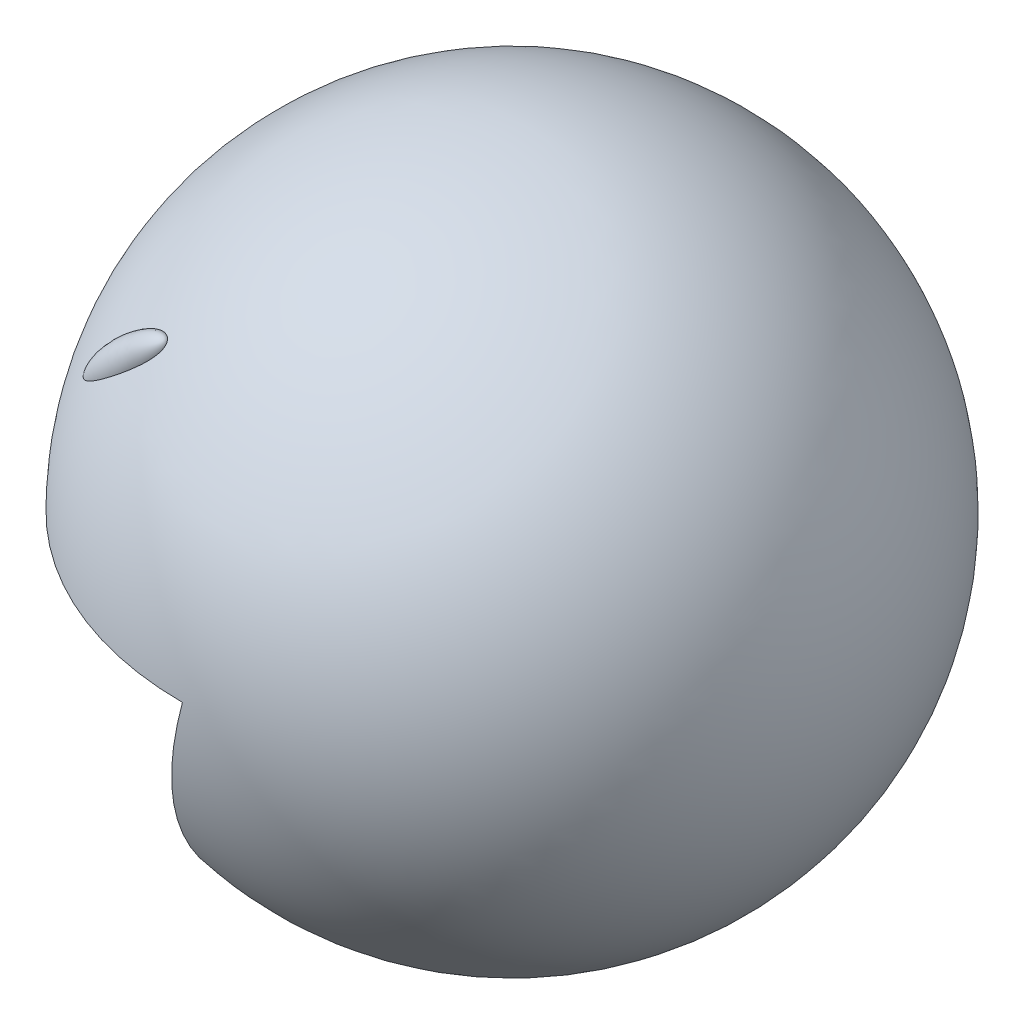
ISO-10303-21;
HEADER;
FILE_DESCRIPTION(('STEP AP214'),'2;1');
FILE_NAME('part.step','',(''),(''),'','','');
FILE_SCHEMA(('AUTOMOTIVE_DESIGN { 1 0 10303 214 1 1 1 1 }'));
ENDSEC;
DATA;
#1=APPLICATION_CONTEXT('core data for automotive mechanical design processes');
#2=APPLICATION_PROTOCOL_DEFINITION('international standard','automotive_design',2000,#1);
#3=PRODUCT_CONTEXT('',#1,'mechanical');
#4=PRODUCT('Part','Part','',(#3));
#5=PRODUCT_RELATED_PRODUCT_CATEGORY('part','',(#4));
#6=PRODUCT_DEFINITION_FORMATION('','',#4);
#7=PRODUCT_DEFINITION_CONTEXT('part definition',#1,'design');
#8=PRODUCT_DEFINITION('design','',#6,#7);
#9=PRODUCT_DEFINITION_SHAPE('','',#8);
#10=(LENGTH_UNIT() NAMED_UNIT(*) SI_UNIT(.MILLI.,.METRE.));
#11=(NAMED_UNIT(*) PLANE_ANGLE_UNIT() SI_UNIT($,.RADIAN.));
#12=(NAMED_UNIT(*) SI_UNIT($,.STERADIAN.) SOLID_ANGLE_UNIT());
#13=UNCERTAINTY_MEASURE_WITH_UNIT(LENGTH_MEASURE(1.E-05),#10,'distance_accuracy_value','');
#14=(GEOMETRIC_REPRESENTATION_CONTEXT(3) GLOBAL_UNCERTAINTY_ASSIGNED_CONTEXT((#13)) GLOBAL_UNIT_ASSIGNED_CONTEXT((#10,
#11,#12)) REPRESENTATION_CONTEXT('',''));
#15=CARTESIAN_POINT('',(0.,0.,0.));
#16=DIRECTION('',(0.,0.,1.));
#17=DIRECTION('',(1.,0.,0.));
#18=AXIS2_PLACEMENT_3D('',#15,#16,#17);
#19=CARTESIAN_POINT('',(0.,0.,0.));
#20=DIRECTION('',(0.,0.,1.));
#21=DIRECTION('',(-0.258819045102531,-0.965925826289065,0.));
#22=AXIS2_PLACEMENT_3D('',#19,#20,#21);
#23=SPHERICAL_SURFACE('',#22,25.4);
#24=CARTESIAN_POINT('',(0.,0.,0.));
#25=DIRECTION('',(0.,1.,0.));
#26=DIRECTION('',(0.,0.,1.));
#27=AXIS2_PLACEMENT_3D('',#24,#25,#26);
#28=CIRCLE('',#27,25.4);
#29=CARTESIAN_POINT('',(0.,0.,-25.4));
#30=VERTEX_POINT('',#29);
#31=CARTESIAN_POINT('',(0.,0.,25.4));
#32=VERTEX_POINT('',#31);
#33=EDGE_CURVE('E58',#30,#32,#28,.T.);
#34=ORIENTED_EDGE('',*,*,#33,.T.);
#35=CARTESIAN_POINT('',(0.,0.,0.));
#36=DIRECTION('',(-0.965925826289065,0.258819045102531,0.));
#37=DIRECTION('',(0.,0.,1.));
#38=AXIS2_PLACEMENT_3D('',#35,#36,#37);
#39=CIRCLE('',#38,25.4);
#40=EDGE_CURVE('E90',#30,#32,#39,.T.);
#41=ORIENTED_EDGE('',*,*,#40,.F.);
#42=EDGE_LOOP('',(#34,#41));
#43=FACE_BOUND('',#42,.T.);
#44=CARTESIAN_POINT('',(-8.89116224380287,15.9455624798362,17.6591696055057));
#45=CARTESIAN_POINT('',(-8.91353390940422,15.9576761112741,17.6369675436586));
#46=CARTESIAN_POINT('',(-8.93827595442611,15.9672566944102,17.6157620967731));
#47=CARTESIAN_POINT('',(-8.99077694117802,15.9819909203043,17.5756379771903));
#48=CARTESIAN_POINT('',(-9.01854682327902,15.9871278671183,17.5567281564562));
#49=CARTESIAN_POINT('',(-9.06952724001722,15.9930757581065,17.5250079443751));
#50=CARTESIAN_POINT('',(-9.09240230293788,15.994588295449,17.5117693149271));
#51=CARTESIAN_POINT('',(-9.13885310717414,15.9957833985665,17.4864798562906));
#52=CARTESIAN_POINT('',(-9.16242926506568,15.9954648538287,17.4744297524243));
#53=CARTESIAN_POINT('',(-9.2338471449283,15.9922229757068,17.4398301149314));
#54=CARTESIAN_POINT('',(-9.28234139969502,15.9870102342752,17.4188531628773));
#55=CARTESIAN_POINT('',(-9.39523485206869,15.9699139555825,17.3740113783389));
#56=CARTESIAN_POINT('',(-9.45983065311779,15.9564459795542,17.3513194374734));
#57=CARTESIAN_POINT('',(-9.58905032846447,15.9242799471311,17.3098901167807));
#58=CARTESIAN_POINT('',(-9.6536740248086,15.9055720475432,17.2911602971638));
#59=CARTESIAN_POINT('',(-9.78276573580876,15.8641583823474,17.2566187626621));
#60=CARTESIAN_POINT('',(-9.84723138560478,15.8414332340195,17.240821993392));
#61=CARTESIAN_POINT('',(-9.97545919052756,15.7929219174829,17.2115873922165));
#62=CARTESIAN_POINT('',(-10.0392218932266,15.7671383476288,17.1981475816246));
#63=CARTESIAN_POINT('',(-10.1674074172732,15.7124745303344,17.1728592010475));
#64=CARTESIAN_POINT('',(-10.2318146499432,15.6835393315435,17.1610513739623));
#65=CARTESIAN_POINT('',(-10.3598699088877,15.6234634510338,17.1390084482133));
#66=CARTESIAN_POINT('',(-10.4235178050829,15.5923223976007,17.1287736155443));
#67=CARTESIAN_POINT('',(-10.613519802455,15.495965443862,17.0999651781532));
#68=CARTESIAN_POINT('',(-10.7387280707426,15.4279049351151,17.083325957848));
#69=CARTESIAN_POINT('',(-10.986241795471,15.2858257941988,17.0536397688818));
#70=CARTESIAN_POINT('',(-11.1085447180255,15.2118021917579,17.0405958377984));
#71=CARTESIAN_POINT('',(-11.3504155219181,15.0587591338079,17.017123140372));
#72=CARTESIAN_POINT('',(-11.4699803011207,14.9797343600308,17.006697218589));
#73=CARTESIAN_POINT('',(-11.7062214529606,14.8175410411014,16.9878030858072));
#74=CARTESIAN_POINT('',(-11.8229008074868,14.7343770664648,16.9793327712655));
#75=CARTESIAN_POINT('',(-12.053558987595,14.564333053911,16.9638587836859));
#76=CARTESIAN_POINT('',(-12.1675385450574,14.4774540414306,16.9568547090387));
#77=CARTESIAN_POINT('',(-12.4986406719455,14.2172137937197,16.9378904412004));
#78=CARTESIAN_POINT('',(-12.7122007795079,14.0391904436293,16.9274458520451));
#79=CARTESIAN_POINT('',(-13.1298655187225,13.6720444690644,16.9091477869116));
#80=CARTESIAN_POINT('',(-13.3339644182545,13.4829152693435,16.901295864523));
#81=CARTESIAN_POINT('',(-13.6326702576118,13.1915638642341,16.8911902736518));
#82=CARTESIAN_POINT('',(-13.7310031422449,13.0931653941925,16.8881003471023));
#83=CARTESIAN_POINT('',(-13.9250850004742,12.8938376233244,16.8825446395112));
#84=CARTESIAN_POINT('',(-14.0208340862428,12.7929084327341,16.8800788313352));
#85=CARTESIAN_POINT('',(-14.2095347830379,12.5885684845242,16.8759117926886));
#86=CARTESIAN_POINT('',(-14.3024880969153,12.4851593093563,16.8742100876428));
#87=CARTESIAN_POINT('',(-14.4854119049357,12.2757332843934,16.8718268863886));
#88=CARTESIAN_POINT('',(-14.5753826842047,12.1697166855621,16.8711452923824));
#89=CARTESIAN_POINT('',(-14.7225145765493,11.9907433194322,16.8712247781343));
#90=CARTESIAN_POINT('',(-14.7806100898902,11.918553708524,16.8715805029799));
#91=CARTESIAN_POINT('',(-14.8951537392473,11.772858196197,16.8731382411201));
#92=CARTESIAN_POINT('',(-14.951601498529,11.6993519998642,16.8743404463956));
#93=CARTESIAN_POINT('',(-15.0626509544263,11.5508763205319,16.8778673739212));
#94=CARTESIAN_POINT('',(-15.1172509506382,11.4759055847459,16.880193101565));
#95=CARTESIAN_POINT('',(-15.2240668714516,11.3246182983741,16.8863664436986));
#96=CARTESIAN_POINT('',(-15.2762883521454,11.248305529782,16.8902102845439));
#97=CARTESIAN_POINT('',(-15.3779256807297,11.0940142631403,16.9000236345202));
#98=CARTESIAN_POINT('',(-15.4273434073731,11.016036929884,16.905991700261));
#99=CARTESIAN_POINT('',(-15.4986394916655,10.8976590163389,16.9173087470176));
#100=CARTESIAN_POINT('',(-15.5219198045683,10.857988943308,16.9214720051228));
#101=CARTESIAN_POINT('',(-15.5673527638898,10.7781257502726,16.9307904323057));
#102=CARTESIAN_POINT('',(-15.5895056009536,10.737932720148,16.9359454329802));
#103=CARTESIAN_POINT('',(-15.6270999202714,10.6670048355815,16.946089903503));
#104=CARTESIAN_POINT('',(-15.6428451067656,10.6363920311191,16.9508043663986));
#105=CARTESIAN_POINT('',(-15.6733782031849,10.5748233900709,16.9611182856303));
#106=CARTESIAN_POINT('',(-15.6881658183702,10.5438674512699,16.9667180126424));
#107=CARTESIAN_POINT('',(-15.7164884157548,10.4817268209021,16.9790045153972));
#108=CARTESIAN_POINT('',(-15.7300275142024,10.4505432757347,16.9856875028492));
#109=CARTESIAN_POINT('',(-15.7555480109054,10.3878827438272,17.0004646018117));
#110=CARTESIAN_POINT('',(-15.7675303960585,10.3564059566923,17.0085578115988));
#111=CARTESIAN_POINT('',(-15.7873399774986,10.2991373317171,17.0249364077842));
#112=CARTESIAN_POINT('',(-15.7955253057462,10.2733807840392,17.0329040823055));
#113=CARTESIAN_POINT('',(-15.8100323632966,10.2217886564012,17.0504753575002));
#114=CARTESIAN_POINT('',(-15.8163488402541,10.1959530560672,17.0600834513743));
#115=CARTESIAN_POINT('',(-15.826402425137,10.1442510735021,17.0815683614553));
#116=CARTESIAN_POINT('',(-15.8301023942054,10.1183892713872,17.093474903901));
#117=CARTESIAN_POINT('',(-15.8334918202353,10.0678972428921,17.1201282134172));
#118=CARTESIAN_POINT('',(-15.8332034685529,10.0432609666991,17.1348588153066));
#119=CARTESIAN_POINT('',(-15.8283882771245,10.0075094798523,17.1601900563493));
#120=CARTESIAN_POINT('',(-15.8258400085053,9.99532356823159,17.1696400195243));
#121=CARTESIAN_POINT('',(-15.8188220456493,9.97233295246547,17.1894644005809));
#122=CARTESIAN_POINT('',(-15.8143547699538,9.96152653189897,17.1998376418443));
#123=CARTESIAN_POINT('',(-15.8034089950129,9.94170786190058,17.2213516922765));
#124=CARTESIAN_POINT('',(-15.7969195823141,9.93270579449217,17.2324964049013));
#125=CARTESIAN_POINT('',(-15.7821365146749,9.91688658738505,17.2551375860941));
#126=CARTESIAN_POINT('',(-15.7738416426139,9.91007092932306,17.2666342874347));
#127=CARTESIAN_POINT('',(-15.7543523256961,9.89771351621112,17.2915003137772));
#128=CARTESIAN_POINT('',(-15.7429052643731,9.89256783538032,17.3048654472691));
#129=CARTESIAN_POINT('',(-15.7187174836094,9.88491885077951,17.3312041110604));
#130=CARTESIAN_POINT('',(-15.7059727253118,9.88242409119676,17.3441762449677));
#131=CARTESIAN_POINT('',(-15.682117164266,9.87985365081647,17.3672080929469));
#132=CARTESIAN_POINT('',(-15.6711338732527,9.8794189666155,17.3773665277677));
#133=CARTESIAN_POINT('',(-15.6488429079147,9.87973964179132,17.3972607961187));
#134=CARTESIAN_POINT('',(-15.6375357023214,9.88049335917986,17.4069971936774));
#135=CARTESIAN_POINT('',(-15.6032220719813,9.88421789652827,17.4356701480589));
#136=CARTESIAN_POINT('',(-15.5798840772967,9.88865598636552,17.4540136086065));
#137=CARTESIAN_POINT('',(-15.523016111191,9.90260847345572,17.4967461853263));
#138=CARTESIAN_POINT('',(-15.4893217044559,9.91347195087049,17.5204393145168));
#139=CARTESIAN_POINT('',(-15.4217630590703,9.93858890058851,17.5657476927051));
#140=CARTESIAN_POINT('',(-15.3878986147256,9.95284918834189,17.5873586399198));
#141=CARTESIAN_POINT('',(-15.3200437282937,9.98377423967947,17.6290199841762));
#142=CARTESIAN_POINT('',(-15.2860535663526,10.0004513142498,17.6490615287892));
#143=CARTESIAN_POINT('',(-15.2182180273397,10.0354856802273,17.6877555787621));
#144=CARTESIAN_POINT('',(-15.1843725372646,10.0538412248051,17.7064094924018));
#145=CARTESIAN_POINT('',(-15.1075035861077,10.0970590666956,17.7475549774737));
#146=CARTESIAN_POINT('',(-15.0645163763225,10.1223223440548,17.7696907751469));
#147=CARTESIAN_POINT('',(-14.9787111322735,10.1743849997504,17.8124417055571));
#148=CARTESIAN_POINT('',(-14.9358931427829,10.2011847588758,17.8330564584106));
#149=CARTESIAN_POINT('',(-14.8074943300026,10.2834323070864,17.8930454976799));
#150=CARTESIAN_POINT('',(-14.7221310487348,10.3406338339724,17.9304794835384));
#151=CARTESIAN_POINT('',(-14.5517130448298,10.4580326002155,18.0013660934404));
#152=CARTESIAN_POINT('',(-14.4666587322928,10.5182328747007,18.0348145625402));
#153=CARTESIAN_POINT('',(-14.2965035351781,10.6408727370253,18.0984491455696));
#154=CARTESIAN_POINT('',(-14.2114033607502,10.7033188301435,18.1286245600075));
#155=CARTESIAN_POINT('',(-14.0414291304073,10.8296068513033,18.1859808742217));
#156=CARTESIAN_POINT('',(-13.9565549243373,10.8934467771124,18.2131657691336));
#157=CARTESIAN_POINT('',(-13.7868815629337,11.0222035912923,18.2648550216));
#158=CARTESIAN_POINT('',(-13.7020823912527,11.0871199300975,18.2893607012839));
#159=CARTESIAN_POINT('',(-13.5107262192317,11.2345564278649,18.3418636861129));
#160=CARTESIAN_POINT('',(-13.40416333975,11.3173239521927,18.3691460320167));
#161=CARTESIAN_POINT('',(-13.1909576119087,11.4838811457365,18.4200451476429));
#162=CARTESIAN_POINT('',(-13.0843147584704,11.5676708861438,18.4436616604715));
#163=CARTESIAN_POINT('',(-12.7639993794182,11.8204397347662,18.5092807851598));
#164=CARTESIAN_POINT('',(-12.5501774604123,11.9906343671267,18.5459885523066));
#165=CARTESIAN_POINT('',(-12.1222215296658,12.3337785085344,18.6055345204631));
#166=CARTESIAN_POINT('',(-11.9080876202482,12.5067322857332,18.628348542331));
#167=CARTESIAN_POINT('',(-11.482185698545,12.8541983372119,18.6591602957676));
#168=CARTESIAN_POINT('',(-11.2704112698412,13.0286940458703,18.6672500072674));
#169=CARTESIAN_POINT('',(-10.9550962797721,13.2929021633789,18.6671743075556));
#170=CARTESIAN_POINT('',(-10.8504519911108,13.3813219950062,18.6651195073828));
#171=CARTESIAN_POINT('',(-10.6422576255451,13.5592232309314,18.6565961052432));
#172=CARTESIAN_POINT('',(-10.5387074296726,13.6487045175166,18.6501279882873));
#173=CARTESIAN_POINT('',(-10.3333996335436,13.8287939388005,18.6323373996493));
#174=CARTESIAN_POINT('',(-10.2316386640062,13.9193992440317,18.6210253724916));
#175=CARTESIAN_POINT('',(-10.0303938432081,14.1022500890869,18.5929129754642));
#176=CARTESIAN_POINT('',(-9.93090934267403,14.1944951475558,18.5761141918908));
#177=CARTESIAN_POINT('',(-9.76758320952331,14.3502974990248,18.5426982681294));
#178=CARTESIAN_POINT('',(-9.70282044247488,14.4132686001412,18.5278531697067));
#179=CARTESIAN_POINT('',(-9.57524802824602,14.5403895442929,18.4948662886622));
#180=CARTESIAN_POINT('',(-9.51243919654789,14.6045398621708,18.4767231506475));
#181=CARTESIAN_POINT('',(-9.38948249845255,14.7342626808406,18.4365809765044));
#182=CARTESIAN_POINT('',(-9.32933622607461,14.7998359994658,18.414579668647));
#183=CARTESIAN_POINT('',(-9.21287421898766,14.9326296244756,18.3659439783674));
#184=CARTESIAN_POINT('',(-9.15655547494705,14.9998485790912,18.3393132957295));
#185=CARTESIAN_POINT('',(-9.07620519423491,15.1024222168787,18.2948482341739));
#186=CARTESIAN_POINT('',(-9.05001849008333,15.1370387714235,18.2792054327653));
#187=CARTESIAN_POINT('',(-8.99952486573137,15.2068082594904,18.246195756219));
#188=CARTESIAN_POINT('',(-8.97521719704867,15.2419609726921,18.2288295739224));
#189=CARTESIAN_POINT('',(-8.9291532031335,15.3126500855968,18.1921707376651));
#190=CARTESIAN_POINT('',(-8.90738485693511,15.3481837287064,18.172888033826));
#191=CARTESIAN_POINT('',(-8.86710740631417,15.4197404804055,18.131963772112));
#192=CARTESIAN_POINT('',(-8.84859555499387,15.4557631485951,18.1103242274574));
#193=CARTESIAN_POINT('',(-8.82060038104238,15.5181295773947,18.0705774097804));
#194=CARTESIAN_POINT('',(-8.81003460797324,15.5444070075234,18.0531384029967));
#195=CARTESIAN_POINT('',(-8.79202074476469,15.596946342603,18.016568538991));
#196=CARTESIAN_POINT('',(-8.78457656826217,15.6232081870882,17.9974355941919));
#197=CARTESIAN_POINT('',(-8.77375384618809,15.6755914680884,17.9571214657986));
#198=CARTESIAN_POINT('',(-8.77042756868211,15.7017069926469,17.9359175637814));
#199=CARTESIAN_POINT('',(-8.7693378220502,15.7525336382561,17.8918283383739));
#200=CARTESIAN_POINT('',(-8.77154918854956,15.7772505923286,17.8689510781588));
#201=CARTESIAN_POINT('',(-8.7811031075466,15.8174761894414,17.828636005237));
#202=CARTESIAN_POINT('',(-8.786840166147,15.8336286910601,17.8114634004692));
#203=CARTESIAN_POINT('',(-8.80195260228824,15.8639609076289,17.7769782988345));
#204=CARTESIAN_POINT('',(-8.81132460382741,15.8781424365936,17.7596659463268));
#205=CARTESIAN_POINT('',(-8.83168044302681,15.9019563490229,17.7282152148223));
#206=CARTESIAN_POINT('',(-8.84215408817582,15.9119534770803,17.7140186356259));
#207=CARTESIAN_POINT('',(-8.86518736030433,15.9301257939536,17.6861515126245));
#208=CARTESIAN_POINT('',(-8.87774873701309,15.9382994409352,17.6724814220078));
#209=CARTESIAN_POINT('',(-8.89116224380287,15.9455624798362,17.6591696055057));
#210=B_SPLINE_CURVE_WITH_KNOTS('',3,(#44,#45,#46,#47,#48,#49,#50,#51,#52,#53,#54,#55,#56,#57,
#58,#59,#60,#61,#62,#63,#64,#65,#66,#67,#68,#69,#70,#71,#72,#73,#74,#75,#76,#77,#78,#79,#80,#81,
#82,#83,#84,#85,#86,#87,#88,#89,#90,#91,#92,#93,#94,#95,#96,#97,#98,#99,#100,#101,#102,#103,
#104,#105,#106,#107,#108,#109,#110,#111,#112,#113,#114,#115,#116,#117,#118,#119,#120,#121,#122,
#123,#124,#125,#126,#127,#128,#129,#130,#131,#132,#133,#134,#135,#136,#137,#138,#139,#140,#141,
#142,#143,#144,#145,#146,#147,#148,#149,#150,#151,#152,#153,#154,#155,#156,#157,#158,#159,#160,
#161,#162,#163,#164,#165,#166,#167,#168,#169,#170,#171,#172,#173,#174,#175,#176,#177,#178,#179,
#180,#181,#182,#183,#184,#185,#186,#187,#188,#189,#190,#191,#192,#193,#194,#195,#196,#197,#198,
#199,#200,#201,#202,#203,#204,#205,#206,#207,#208,#209),.UNSPECIFIED.,.T.,.F.,(4,2,2,2,2,2,2,2,
2,2,2,2,2,2,2,2,2,2,2,2,2,2,2,2,2,2,2,2,2,2,2,2,2,2,2,2,2,2,2,2,2,2,2,2,2,2,2,2,2,2,2,2,2,2,2,2,
2,2,2,2,2,2,2,2,2,2,2,2,2,2,2,2,2,2,2,2,2,2,2,2,2,2,4),(0.,0.10120529419998,0.202789212677829,
0.282098259649611,0.361455410963232,0.520297356300216,0.729191980837396,0.938481676372725,
1.14881019262369,1.35896128214515,1.57366146574921,1.78839791550884,2.21854740972899,
2.64905922114506,3.08003679437063,3.51054860535159,3.94094234259158,4.77514794947265,
5.60985252947592,6.02724620172233,6.44462172409286,6.86173765984401,7.27881360422186,
7.55678136879563,7.83481219652715,8.11309228470094,8.39068494935879,8.66808935144529,
8.80662317798642,8.94513350146849,9.04935092299907,9.15360027160965,9.25749261616,
9.36131877208091,9.4457693605537,9.53045508795438,9.6163199516995,9.70170724914391,
9.74842617593341,9.79508639441012,9.84200293158506,9.8889511952694,9.94365023838884,
9.99852505220739,10.0433629123798,10.0881388753378,10.1779373449474,10.3054451853416,
10.4332110483898,10.5616522469223,10.689961262395,10.8535637954206,11.0172070510945,
11.3451110506385,11.6733539569127,12.0026394436745,12.3314795432084,12.6601566284178,
13.0730769968752,13.4860262888793,14.3128455333887,15.1410996014531,15.9641617320119,
16.3751402995945,16.7860737090867,17.1961254834716,17.6060588110672,17.8806165734947,
18.1552874268782,18.4301205555907,18.7047350397849,18.8430944644174,18.9813984888136,
19.1190186615358,19.2565221872559,19.3561605356829,19.4559234328127,19.5569400415128,
19.6574984404267,19.7299732748642,19.8023809579024,19.8630101198063,19.9236903536836),.UNSPECIFIED.);
#211=CARTESIAN_POINT('',(-8.89116224380287,15.9455624798362,17.6591696055057));
#212=VERTEX_POINT('',#211);
#213=EDGE_CURVE('E52',#212,#212,#210,.T.);
#214=ORIENTED_EDGE('',*,*,#213,.F.);
#215=EDGE_LOOP('',(#214));
#216=FACE_BOUND('',#215,.T.);
#217=CARTESIAN_POINT('',(-8.89116224380287,15.9455624798362,-17.6591696055057));
#218=CARTESIAN_POINT('',(-8.87506617994639,15.9368429347615,-17.6751471653895));
#219=CARTESIAN_POINT('',(-8.86018174898737,15.9268064160932,-17.6916536127124));
#220=CARTESIAN_POINT('',(-8.83353715171044,15.9041066419649,-17.7253661003245));
#221=CARTESIAN_POINT('',(-8.82177514512509,15.8914449415845,-17.7425717216144));
#222=CARTESIAN_POINT('',(-8.80182206535519,15.8637845188574,-17.7772005647822));
#223=CARTESIAN_POINT('',(-8.79363384276068,15.8487839438286,-17.7946239490043));
#224=CARTESIAN_POINT('',(-8.78091192409823,15.8169888702256,-17.8291626714412));
#225=CARTESIAN_POINT('',(-8.77638133944998,15.800192858061,-17.8462777353062));
#226=CARTESIAN_POINT('',(-8.7698113480805,15.7599524652838,-17.8850587461691));
#227=CARTESIAN_POINT('',(-8.76899482609105,15.7360721182846,-17.9064731960123));
#228=CARTESIAN_POINT('',(-8.77210672263761,15.6872466468916,-17.9477426546825));
#229=CARTESIAN_POINT('',(-8.77605185636506,15.6622980698243,-17.9675919079054));
#230=CARTESIAN_POINT('',(-8.78665554408386,15.6162231219528,-18.0024713253789));
#231=CARTESIAN_POINT('',(-8.79275423042017,15.5951505555035,-18.0177541714405));
#232=CARTESIAN_POINT('',(-8.80699218190525,15.5529886213668,-18.0472198621241));
#233=CARTESIAN_POINT('',(-8.81512838589281,15.5318993257736,-18.0614043154853));
#234=CARTESIAN_POINT('',(-8.83307331726647,15.4897323017638,-18.0888287102642));
#235=CARTESIAN_POINT('',(-8.84288676737257,15.4686547794075,-18.1020658306617));
#236=CARTESIAN_POINT('',(-8.8638704879387,15.4266296320928,-18.1276477844707));
#237=CARTESIAN_POINT('',(-8.87504127583641,15.4056820598919,-18.1399922747195));
#238=CARTESIAN_POINT('',(-8.91764531409524,15.3298602882951,-18.1833975068414));
#239=CARTESIAN_POINT('',(-8.95236590579572,15.275470594548,-18.2120866699802));
#240=CARTESIAN_POINT('',(-9.02670481856741,15.1679524211264,-18.2651803743724));
#241=CARTESIAN_POINT('',(-9.06633141512534,15.114826257743,-18.2895775032937));
#242=CARTESIAN_POINT('',(-9.14916752981565,15.009505507358,-18.3350075998981));
#243=CARTESIAN_POINT('',(-9.19239343863919,14.9573166635913,-18.3560237386966));
#244=CARTESIAN_POINT('',(-9.28128206906786,14.8540311325336,-18.3951239415363));
#245=CARTESIAN_POINT('',(-9.32694281976839,14.8029336074185,-18.4132103306036));
#246=CARTESIAN_POINT('',(-9.42119419453365,14.7004826528275,-18.4472805784467));
#247=CARTESIAN_POINT('',(-9.46982790478031,14.6491500036191,-18.4632070236563));
#248=CARTESIAN_POINT('',(-9.56861181906298,14.5472900135813,-18.4927898267091));
#249=CARTESIAN_POINT('',(-9.6187622816225,14.4967628123037,-18.5064457949532));
#250=CARTESIAN_POINT('',(-9.77115360247719,14.3460616419846,-18.5444370595676));
#251=CARTESIAN_POINT('',(-9.87518364338375,14.2469288254725,-18.5657437423697));
#252=CARTESIAN_POINT('',(-10.0863804060729,14.0507107668846,-18.6017091462719));
#253=CARTESIAN_POINT('',(-10.1935496698354,13.9536273002037,-18.6163623118808));
#254=CARTESIAN_POINT('',(-10.4100823162818,13.76099575266,-18.6399125695427));
#255=CARTESIAN_POINT('',(-10.5194479958496,13.6654494898361,-18.6488032736632));
#256=CARTESIAN_POINT('',(-10.7394641432523,13.475757254542,-18.661430592446));
#257=CARTESIAN_POINT('',(-10.8501131084513,13.3816098910269,-18.6651727209315));
#258=CARTESIAN_POINT('',(-11.0723157747901,13.1943900709768,-18.6679672203932));
#259=CARTESIAN_POINT('',(-11.1838692378018,13.1013173462214,-18.6670207881142));
#260=CARTESIAN_POINT('',(-11.5031451557502,12.8368623127317,-18.6581129312098));
#261=CARTESIAN_POINT('',(-11.7115959894308,12.6665191296876,-18.6448485377168));
#262=CARTESIAN_POINT('',(-12.1291725314214,12.3281460526236,-18.6046409728368));
#263=CARTESIAN_POINT('',(-12.3382985179957,12.1601173205282,-18.5776911708572));
#264=CARTESIAN_POINT('',(-12.7563420156248,11.8265877518047,-18.5105414142172));
#265=CARTESIAN_POINT('',(-12.9652595751326,11.6610860052497,-18.4703463526018));
#266=CARTESIAN_POINT('',(-13.278314874228,11.415503827992,-18.3997492007945));
#267=CARTESIAN_POINT('',(-13.382597620272,11.3341001058662,-18.3745039188993));
#268=CARTESIAN_POINT('',(-13.591107861947,11.1724425843757,-18.3203833093139));
#269=CARTESIAN_POINT('',(-13.6953353609507,11.0921887044642,-18.2915082372901));
#270=CARTESIAN_POINT('',(-13.903785619184,10.9332427197394,-18.2298402003418));
#271=CARTESIAN_POINT('',(-14.0080083729021,10.8545502236928,-18.1970482317011));
#272=CARTESIAN_POINT('',(-14.2166218545267,10.6993433001061,-18.1270473866387));
#273=CARTESIAN_POINT('',(-14.3210126012794,10.6228291379898,-18.0898379747956));
#274=CARTESIAN_POINT('',(-14.5298210112347,10.473288564123,-18.0103450997571));
#275=CARTESIAN_POINT('',(-14.6342373649234,10.4002511333659,-17.9680793995858));
#276=CARTESIAN_POINT('',(-14.7913935740047,10.2946431584729,-17.8997068389826));
#277=CARTESIAN_POINT('',(-14.8438787295339,10.2600916497334,-17.8760814691612));
#278=CARTESIAN_POINT('',(-14.9490650408441,10.1927834895238,-17.8268651884077));
#279=CARTESIAN_POINT('',(-15.0017661430569,10.1600264188384,-17.8012747399399));
#280=CARTESIAN_POINT('',(-15.1097374455533,10.0956136048948,-17.7465297923522));
#281=CARTESIAN_POINT('',(-15.1650203232207,10.0640664818397,-17.7172691150512));
#282=CARTESIAN_POINT('',(-15.2481219667759,10.0198627279163,-17.6708332917136));
#283=CARTESIAN_POINT('',(-15.2758312703177,10.0056570980667,-17.6549433877267));
#284=CARTESIAN_POINT('',(-15.3313010112445,9.97858358734867,-17.6221536828406));
#285=CARTESIAN_POINT('',(-15.3590614402131,9.96571550338507,-17.6052540358781));
#286=CARTESIAN_POINT('',(-15.4207918205566,9.93905337878656,-17.5663377509364));
#287=CARTESIAN_POINT('',(-15.4547679488164,9.92569124371666,-17.5440196617097));
#288=CARTESIAN_POINT('',(-15.5055138353316,9.90862358624531,-17.5088170768797));
#289=CARTESIAN_POINT('',(-15.522384663794,9.90343207863153,-17.4968015159951));
#290=CARTESIAN_POINT('',(-15.5559802091449,9.89431011052593,-17.4721081186567));
#291=CARTESIAN_POINT('',(-15.5727049847707,9.89037911800836,-17.4594305642449));
#292=CARTESIAN_POINT('',(-15.6075437008896,9.88382242938998,-17.4320160902276));
#293=CARTESIAN_POINT('',(-15.6256292039463,9.88136668634832,-17.417200035519));
#294=CARTESIAN_POINT('',(-15.6611344928009,9.87910647618962,-17.3865658207676));
#295=CARTESIAN_POINT('',(-15.678554916998,9.87929939904684,-17.3707486625248));
#296=CARTESIAN_POINT('',(-15.7080354745801,9.88279924140245,-17.3420938134633));
#297=CARTESIAN_POINT('',(-15.720374574782,9.88534335719286,-17.3294583790464));
#298=CARTESIAN_POINT('',(-15.7438075796501,9.89296327825798,-17.3038179313654));
#299=CARTESIAN_POINT('',(-15.7549048243994,9.8980320824473,-17.290814033397));
#300=CARTESIAN_POINT('',(-15.7736153111714,9.90995470122962,-17.2669070425123));
#301=CARTESIAN_POINT('',(-15.7815015788125,9.9163822745368,-17.256007399689));
#302=CARTESIAN_POINT('',(-15.7956642551115,9.93120976531341,-17.2345085158016));
#303=CARTESIAN_POINT('',(-15.8019415313694,9.93960861513102,-17.2239091155951));
#304=CARTESIAN_POINT('',(-15.8126949527135,9.95810780861729,-17.2033423155129));
#305=CARTESIAN_POINT('',(-15.817173963301,9.96820540862631,-17.1933739316513));
#306=CARTESIAN_POINT('',(-15.8243742701346,9.98971227363844,-17.1742554189753));
#307=CARTESIAN_POINT('',(-15.8270937842853,10.001122854756,-17.1651061278278));
#308=CARTESIAN_POINT('',(-15.8347698974713,10.048234469875,-17.1305276885891));
#309=CARTESIAN_POINT('',(-15.8335647681798,10.0874687093483,-17.1085688124609));
#310=CARTESIAN_POINT('',(-15.8259479342382,10.1459396813284,-17.0809756857705));
#311=CARTESIAN_POINT('',(-15.8226153818577,10.1648166758361,-17.0728375932625));
#312=CARTESIAN_POINT('',(-15.8145859099687,10.2027273228042,-17.0576567761756));
#313=CARTESIAN_POINT('',(-15.8098912034313,10.2217606728958,-17.0506123031611));
#314=CARTESIAN_POINT('',(-15.7994227190886,10.2598916267273,-17.0374089424773));
#315=CARTESIAN_POINT('',(-15.7936453852138,10.278989232485,-17.031253095115));
#316=CARTESIAN_POINT('',(-15.7812340864104,10.3171380318168,-17.0196870984359));
#317=CARTESIAN_POINT('',(-15.7745998434229,10.3361892082716,-17.0142771923531));
#318=CARTESIAN_POINT('',(-15.7558706520752,10.3871755355953,-17.000598777107));
#319=CARTESIAN_POINT('',(-15.7431394226118,10.4190284607,-16.9928997158386));
#320=CARTESIAN_POINT('',(-15.7162147806227,10.4824150808111,-16.9788339902551));
#321=CARTESIAN_POINT('',(-15.7020205199033,10.5139485788632,-16.9724681054077));
#322=CARTESIAN_POINT('',(-15.6577030702118,10.60813728168,-16.954902357437));
#323=CARTESIAN_POINT('',(-15.6258837244,10.67028200321,-16.9452587867844));
#324=CARTESIAN_POINT('',(-15.5590950716911,10.7935565146411,-16.9286357888324));
#325=CARTESIAN_POINT('',(-15.5241113802529,10.8546800022764,-16.9216693695211));
#326=CARTESIAN_POINT('',(-15.4519300937156,10.9756912857481,-16.9096732588659));
#327=CARTESIAN_POINT('',(-15.4147351719037,11.0355804603742,-16.9046412817081));
#328=CARTESIAN_POINT('',(-15.3238844922711,11.1772203497263,-16.8943155735222));
#329=CARTESIAN_POINT('',(-15.2694135988771,11.2584926327704,-16.8896696189959));
#330=CARTESIAN_POINT('',(-15.1578225661309,11.4192958227643,-16.8822300925391));
#331=CARTESIAN_POINT('',(-15.1007017986049,11.4988263101617,-16.8794369622611));
#332=CARTESIAN_POINT('',(-14.9841624739967,11.6564494582867,-16.8751796970751));
#333=CARTESIAN_POINT('',(-14.9247397821212,11.7345391207606,-16.87371808138));
#334=CARTESIAN_POINT('',(-14.8039937304364,11.8892503963462,-16.8717849167153));
#335=CARTESIAN_POINT('',(-14.7426702335699,11.965871902949,-16.8713134393089));
#336=CARTESIAN_POINT('',(-14.556055073661,12.1938105243636,-16.8710057036056));
#337=CARTESIAN_POINT('',(-14.4282259930079,12.3430581919844,-16.8722790224519));
#338=CARTESIAN_POINT('',(-14.1663004003248,12.6370195402528,-16.8766287757429));
#339=CARTESIAN_POINT('',(-14.0321797849612,12.7817115063802,-16.8797127729019));
#340=CARTESIAN_POINT('',(-13.758875447554,13.0658313673248,-16.8871611796531));
#341=CARTESIAN_POINT('',(-13.6196985870898,13.2052659086376,-16.8915239069112));
#342=CARTESIAN_POINT('',(-13.3364976758839,13.4788856432823,-16.9013679344624));
#343=CARTESIAN_POINT('',(-13.1924769536071,13.6130743095575,-16.90684847925));
#344=CARTESIAN_POINT('',(-12.899436539205,13.8761890889372,-16.9190653760879));
#345=CARTESIAN_POINT('',(-12.7504109860052,14.0051086100271,-16.9258032458359));
#346=CARTESIAN_POINT('',(-12.4474124804438,14.2571325649102,-16.9409269822151));
#347=CARTESIAN_POINT('',(-12.2934361113698,14.3802328313632,-16.9493140083265));
#348=CARTESIAN_POINT('',(-11.9802486662185,14.6200054210582,-16.9684454807193));
#349=CARTESIAN_POINT('',(-11.8210287093872,14.7366658380133,-16.9791941218898));
#350=CARTESIAN_POINT('',(-11.4991995857318,14.9609699123141,-17.0039986100341));
#351=CARTESIAN_POINT('',(-11.3366481752092,15.0686997618393,-17.0180161575069));
#352=CARTESIAN_POINT('',(-11.0889367057112,15.2232053104912,-17.042858632336));
#353=CARTESIAN_POINT('',(-11.0057706820855,15.2734971313988,-17.0517688934662));
#354=CARTESIAN_POINT('',(-10.8380707813954,15.3714132380967,-17.0711861158519));
#355=CARTESIAN_POINT('',(-10.7535370801222,15.4190378632531,-17.0816928733395));
#356=CARTESIAN_POINT('',(-10.583266405772,15.5110779364801,-17.1046897031889));
#357=CARTESIAN_POINT('',(-10.4975328308598,15.5555008555582,-17.1171749255219));
#358=CARTESIAN_POINT('',(-10.3246631332353,15.6406426745038,-17.1447103712418));
#359=CARTESIAN_POINT('',(-10.2375275628744,15.6813629929915,-17.1597596058438));
#360=CARTESIAN_POINT('',(-10.1100409737417,15.7371110201868,-17.1840722955571));
#361=CARTESIAN_POINT('',(-10.0702348719906,15.7539837044393,-17.1919835639035));
#362=CARTESIAN_POINT('',(-9.99034497250018,15.7866630367258,-17.2086085741948));
#363=CARTESIAN_POINT('',(-9.95026114219675,15.802469557335,-17.2173224117671));
#364=CARTESIAN_POINT('',(-9.86972021747333,15.8329099958833,-17.235705023339));
#365=CARTESIAN_POINT('',(-9.82926236026302,15.8475402176079,-17.245376609451));
#366=CARTESIAN_POINT('',(-9.74813394660197,15.8753760745687,-17.265811949675));
#367=CARTESIAN_POINT('',(-9.70746341359941,15.8885818635202,-17.2765755856965));
#368=CARTESIAN_POINT('',(-9.62557292250345,15.9134306447186,-17.2995101764986));
#369=CARTESIAN_POINT('',(-9.58435146282216,15.9250572266182,-17.311693775244));
#370=CARTESIAN_POINT('',(-9.5018771016244,15.9462271977941,-17.3376512160303));
#371=CARTESIAN_POINT('',(-9.4606242133632,15.9557712151443,-17.351424576699));
#372=CARTESIAN_POINT('',(-9.37838518404315,15.9722480791596,-17.3808847170753));
#373=CARTESIAN_POINT('',(-9.33739863267838,15.9791874486505,-17.3965665849601));
#374=CARTESIAN_POINT('',(-9.25601199729477,15.9897478063974,-17.4303233108386));
#375=CARTESIAN_POINT('',(-9.21561114733518,15.9933736039743,-17.4483946569627));
#376=CARTESIAN_POINT('',(-9.14112520836958,15.9960605285409,-17.4850615891488));
#377=CARTESIAN_POINT('',(-9.1068881084694,15.9956414649786,-17.503301118124));
#378=CARTESIAN_POINT('',(-9.04039173712272,15.990431292309,-17.5424886979252));
#379=CARTESIAN_POINT('',(-9.00812559191366,15.9856564276918,-17.5634264371027));
#380=CARTESIAN_POINT('',(-8.96210194564665,15.9742279855506,-17.5973054229367));
#381=CARTESIAN_POINT('',(-8.94701665278976,15.9696385905516,-17.6091432047871));
#382=CARTESIAN_POINT('',(-8.91807538311882,15.9588431472436,-17.633594209715));
#383=CARTESIAN_POINT('',(-8.90422011336483,15.9526361770605,-17.6462078718333));
#384=CARTESIAN_POINT('',(-8.89116224380287,15.9455624798362,-17.6591696055057));
#385=B_SPLINE_CURVE_WITH_KNOTS('',3,(#217,#218,#219,#220,#221,#222,#223,#224,#225,#226,#227,
#228,#229,#230,#231,#232,#233,#234,#235,#236,#237,#238,#239,#240,#241,#242,#243,#244,#245,#246,
#247,#248,#249,#250,#251,#252,#253,#254,#255,#256,#257,#258,#259,#260,#261,#262,#263,#264,#265,
#266,#267,#268,#269,#270,#271,#272,#273,#274,#275,#276,#277,#278,#279,#280,#281,#282,#283,#284,
#285,#286,#287,#288,#289,#290,#291,#292,#293,#294,#295,#296,#297,#298,#299,#300,#301,#302,#303,
#304,#305,#306,#307,#308,#309,#310,#311,#312,#313,#314,#315,#316,#317,#318,#319,#320,#321,#322,
#323,#324,#325,#326,#327,#328,#329,#330,#331,#332,#333,#334,#335,#336,#337,#338,#339,#340,#341,
#342,#343,#344,#345,#346,#347,#348,#349,#350,#351,#352,#353,#354,#355,#356,#357,#358,#359,#360,
#361,#362,#363,#364,#365,#366,#367,#368,#369,#370,#371,#372,#373,#374,#375,#376,#377,#378,#379,
#380,#381,#382,#383,#384),.UNSPECIFIED.,.T.,.F.,(4,2,2,2,2,2,2,2,2,2,2,2,2,2,2,2,2,2,2,2,2,2,2,
2,2,2,2,2,2,2,2,2,2,2,2,2,2,2,2,2,2,2,2,2,2,2,2,2,2,2,2,2,2,2,2,2,2,2,2,2,2,2,2,2,2,2,2,2,2,2,2,
2,2,2,2,2,2,2,2,2,2,2,2,4),(0.,0.0728327416000643,0.145622461886733,0.218470136466995,
0.291379714813599,0.387100262000547,0.483157803617656,0.563252419872305,0.643227416631218,
0.723431429817607,0.803666114480315,1.01498456293557,1.22666444977445,1.43936738714929,
1.65190068930909,1.86928511155792,2.08670679715417,2.52222783185433,2.95811184811466,
3.39447823756136,3.83037693943051,4.26616438484636,5.07430916001965,5.88284585615982,
6.69108419804793,7.09508299992219,7.49905336183353,7.90292118964418,8.30683801880464,
8.70937538146203,8.91072912001514,9.11203561607353,9.32203395912467,9.42687635707931,
9.53170281226292,9.65987236858595,9.72389543146954,9.78789143645552,9.85829051424766,
9.92862022496527,9.9819757964845,10.0351842273,10.0797102204267,10.1242121535068,
10.1686428894565,10.2131185566503,10.3452879604441,10.4077920956008,10.4701952490288,
10.5328070877055,10.5954392945995,10.7008245750026,10.8062713000004,11.0174895300584,
11.229721447649,11.441701806996,11.7354520937179,12.0292723757326,12.323647415303,
12.6180437303597,13.2073734267915,13.7991822831388,14.3902160070282,14.9808515815044,
15.5722047697141,16.163975219629,16.7568054420635,17.3430109239628,17.6357571071587,
17.928465957194,18.2204680526972,18.5123577944466,18.6441979969154,18.7760539287231,
18.9083091875516,19.0405501599632,19.1740745013176,19.307558517683,19.4407059832954,
19.5736598902275,19.6897805622913,19.8054699374347,19.8645214894084,19.9236067693957),.UNSPECIFIED.);
#386=CARTESIAN_POINT('',(-8.89116224380287,15.9455624798362,-17.6591696055057));
#387=VERTEX_POINT('',#386);
#388=EDGE_CURVE('E11',#387,#387,#385,.T.);
#389=ORIENTED_EDGE('',*,*,#388,.F.);
#390=EDGE_LOOP('',(#389));
#391=FACE_BOUND('',#390,.T.);
#392=ADVANCED_FACE('F39',(#43,#216,#391),#23,.T.);
#393=CARTESIAN_POINT('',(0.,0.,0.));
#394=DIRECTION('',(-0.965925826289065,0.258819045102531,0.));
#395=DIRECTION('',(0.,0.,1.));
#396=AXIS2_PLACEMENT_3D('',#393,#394,#395);
#397=PLANE('',#396);
#398=ORIENTED_EDGE('',*,*,#40,.T.);
#399=DIRECTION('',(0.,0.,-1.));
#400=VECTOR('',#399,1.);
#401=CARTESIAN_POINT('',(0.,0.,25.4));
#402=LINE('',#401,#400);
#403=EDGE_CURVE('E62',#32,#30,#402,.T.);
#404=ORIENTED_EDGE('',*,*,#403,.T.);
#405=EDGE_LOOP('',(#398,#404));
#406=FACE_BOUND('',#405,.T.);
#407=ADVANCED_FACE('F76',(#406),#397,.T.);
#408=CARTESIAN_POINT('',(0.,0.,0.));
#409=DIRECTION('',(0.,1.,0.));
#410=DIRECTION('',(0.,0.,1.));
#411=AXIS2_PLACEMENT_3D('',#408,#409,#410);
#412=PLANE('',#411);
#413=ORIENTED_EDGE('',*,*,#33,.F.);
#414=ORIENTED_EDGE('',*,*,#403,.F.);
#415=EDGE_LOOP('',(#413,#414));
#416=FACE_BOUND('',#415,.T.);
#417=ADVANCED_FACE('F81',(#416),#412,.F.);
#418=CARTESIAN_POINT('',(-12.4692533210985,12.3674714025405,17.1637186750218));
#419=DIRECTION('',(-0.707106781186549,0.707106781186546,0.));
#420=DIRECTION('',(-0.700666580653032,-0.700666580653034,-0.134657660428115));
#421=AXIS2_PLACEMENT_3D('',#418,#419,#420);
#422=ELLIPSE('',#421,5.1266929915221,1.42679260927607);
#423=TRIMMED_CURVE('',#422,(PARAMETER_VALUE(3.14159265358979)),
(PARAMETER_VALUE(6.28318530717959)),.T.,.PARAMETER.);
#424=CARTESIAN_POINT('',(-16.0613557695261,8.77536895411288,16.4733701910502));
#425=DIRECTION('',(-0.700666580653032,-0.700666580653034,-0.134657660428115));
#426=AXIS1_PLACEMENT('',#424,#425);
#427=SURFACE_OF_REVOLUTION('',#423,#426);
#428=CARTESIAN_POINT('',(-8.87715087267082,15.9595738509682,17.8540671589933));
#429=VERTEX_POINT('',#428);
#430=VERTEX_LOOP('',#429);
#431=FACE_BOUND('',#430,.T.);
#432=ORIENTED_EDGE('',*,*,#213,.T.);
#433=EDGE_LOOP('',(#432));
#434=FACE_BOUND('',#433,.T.);
#435=ADVANCED_FACE('F72',(#431,#434),#427,.T.);
#436=CARTESIAN_POINT('',(-12.4692533210985,12.3674714025405,-17.1637186750218));
#437=DIRECTION('',(0.707106781186549,-0.707106781186546,0.));
#438=DIRECTION('',(-0.700666580653032,-0.700666580653034,0.134657660428115));
#439=AXIS2_PLACEMENT_3D('',#436,#437,#438);
#440=ELLIPSE('',#439,5.1266929915221,1.42679260927607);
#441=TRIMMED_CURVE('',#440,(PARAMETER_VALUE(3.14159265358979)),
(PARAMETER_VALUE(6.28318530717959)),.T.,.PARAMETER.);
#442=CARTESIAN_POINT('',(-16.0613557695261,8.77536895411288,-16.4733701910502));
#443=DIRECTION('',(-0.700666580653032,-0.700666580653034,0.134657660428115));
#444=AXIS1_PLACEMENT('',#442,#443);
#445=SURFACE_OF_REVOLUTION('',#441,#444);
#446=CARTESIAN_POINT('',(-8.87715087267082,15.9595738509682,-17.8540671589933));
#447=VERTEX_POINT('',#446);
#448=VERTEX_LOOP('',#447);
#449=FACE_BOUND('',#448,.T.);
#450=ORIENTED_EDGE('',*,*,#388,.T.);
#451=EDGE_LOOP('',(#450));
#452=FACE_BOUND('',#451,.T.);
#453=ADVANCED_FACE('F69',(#449,#452),#445,.T.);
#454=CLOSED_SHELL('',(#392,#407,#417,#435,#453));
#455=MANIFOLD_SOLID_BREP('B2',#454);
#456=ADVANCED_BREP_SHAPE_REPRESENTATION('',(#18,#455),#14);
#457=SHAPE_DEFINITION_REPRESENTATION(#9,#456);
ENDSEC;
END-ISO-10303-21;
